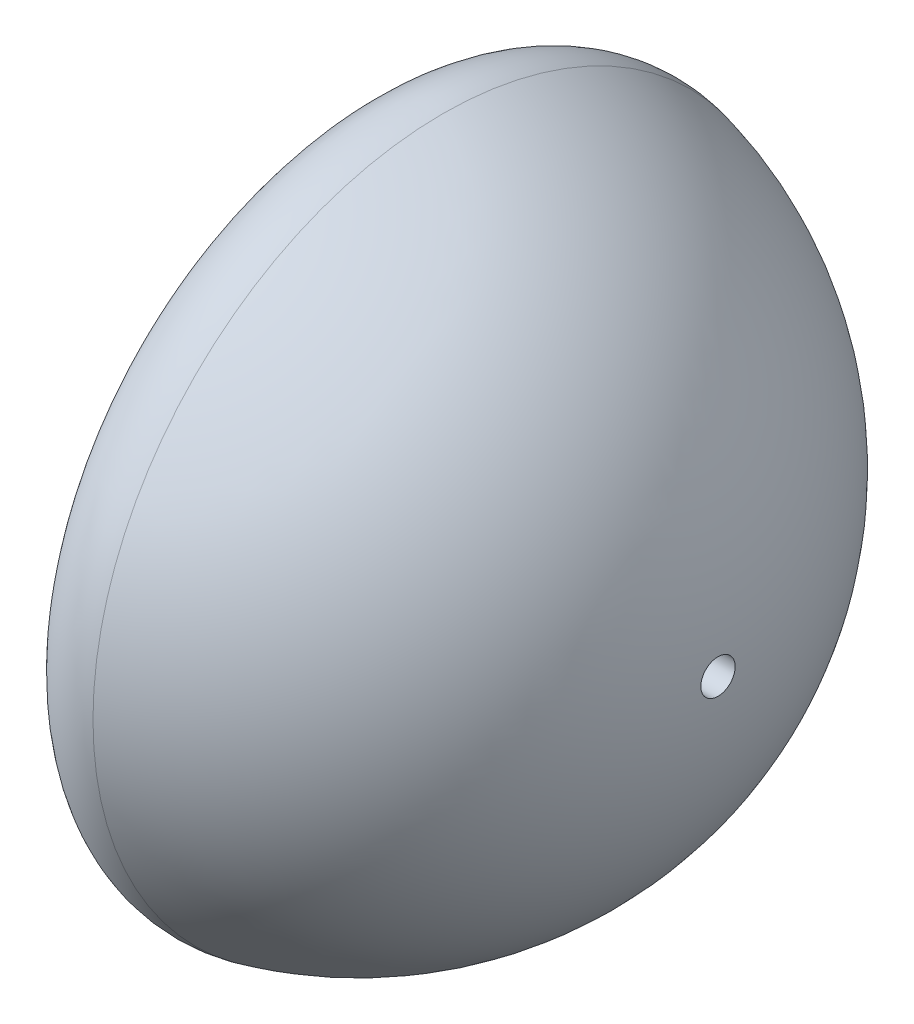
ISO-10303-21;
HEADER;
FILE_DESCRIPTION(('STEP AP214'),'2;1');
FILE_NAME('part.step','',(''),(''),'','','');
FILE_SCHEMA(('AUTOMOTIVE_DESIGN { 1 0 10303 214 1 1 1 1 }'));
ENDSEC;
DATA;
#1=APPLICATION_CONTEXT('core data for automotive mechanical design processes');
#2=APPLICATION_PROTOCOL_DEFINITION('international standard','automotive_design',2000,#1);
#3=PRODUCT_CONTEXT('',#1,'mechanical');
#4=PRODUCT('Part','Part','',(#3));
#5=PRODUCT_RELATED_PRODUCT_CATEGORY('part','',(#4));
#6=PRODUCT_DEFINITION_FORMATION('','',#4);
#7=PRODUCT_DEFINITION_CONTEXT('part definition',#1,'design');
#8=PRODUCT_DEFINITION('design','',#6,#7);
#9=PRODUCT_DEFINITION_SHAPE('','',#8);
#10=(LENGTH_UNIT() NAMED_UNIT(*) SI_UNIT(.MILLI.,.METRE.));
#11=(NAMED_UNIT(*) PLANE_ANGLE_UNIT() SI_UNIT($,.RADIAN.));
#12=(NAMED_UNIT(*) SI_UNIT($,.STERADIAN.) SOLID_ANGLE_UNIT());
#13=UNCERTAINTY_MEASURE_WITH_UNIT(LENGTH_MEASURE(1.E-05),#10,'distance_accuracy_value','');
#14=(GEOMETRIC_REPRESENTATION_CONTEXT(3) GLOBAL_UNCERTAINTY_ASSIGNED_CONTEXT((#13)) GLOBAL_UNIT_ASSIGNED_CONTEXT((#10,
#11,#12)) REPRESENTATION_CONTEXT('',''));
#15=CARTESIAN_POINT('',(0.,0.,0.));
#16=DIRECTION('',(0.,0.,1.));
#17=DIRECTION('',(1.,0.,0.));
#18=AXIS2_PLACEMENT_3D('',#15,#16,#17);
#19=CARTESIAN_POINT('',(-118.89851941294,-0.000180617697867966,0.));
#20=DIRECTION('',(1.,0.,0.));
#21=DIRECTION('',(0.,1.,0.));
#22=AXIS2_PLACEMENT_3D('',#19,#20,#21);
#23=SPHERICAL_SURFACE('',#22,52.5000661966338);
#24=CARTESIAN_POINT('',(-106.545581901332,-0.000180617697866454,0.));
#25=DIRECTION('',(-1.,0.,0.));
#26=DIRECTION('',(0.,-1.,0.));
#27=AXIS2_PLACEMENT_3D('',#24,#25,#26);
#28=CIRCLE('',#27,51.026090242985);
#29=CARTESIAN_POINT('',(-106.545581901332,51.0259096252872,0.));
#30=VERTEX_POINT('',#29);
#31=EDGE_CURVE('E40',#30,#30,#28,.F.);
#32=CARTESIAN_POINT('',(-66.4580138884564,-0.000180617697861543,0.));
#33=DIRECTION('',(1.,0.,0.));
#34=DIRECTION('',(0.,1.,0.));
#35=AXIS2_PLACEMENT_3D('',#32,#33,#34);
#36=CIRCLE('',#35,2.50006619663381);
#37=CARTESIAN_POINT('',(-66.4580138884564,2.49988557893601,0.));
#38=VERTEX_POINT('',#37);
#39=EDGE_CURVE('E44',#38,#38,#36,.T.);
#40=CARTESIAN_POINT('',(-106.545581901332,51.0259096252872,0.));
#41=CARTESIAN_POINT('',(-105.862235466137,50.8604862838573,0.));
#42=CARTESIAN_POINT('',(-105.182216561226,50.6813203845043,0.));
#43=CARTESIAN_POINT('',(-103.829921444039,50.2958271993965,0.));
#44=CARTESIAN_POINT('',(-103.157645231762,50.0894999136416,0.));
#45=CARTESIAN_POINT('',(-101.821923131907,49.650007685174,0.));
#46=CARTESIAN_POINT('',(-101.158477244329,49.4168427424614,0.));
#47=CARTESIAN_POINT('',(-99.8414858263235,48.9240539888163,0.));
#48=CARTESIAN_POINT('',(-99.1879402958957,48.6644301778839,0.));
#49=CARTESIAN_POINT('',(-97.8918045435566,48.1191420314124,0.));
#50=CARTESIAN_POINT('',(-97.2492143216454,47.8334776958734,0.));
#51=CARTESIAN_POINT('',(-95.9760262164591,47.2365697141007,0.));
#52=CARTESIAN_POINT('',(-95.3454283331841,46.925326067867,0.));
#53=CARTESIAN_POINT('',(-94.0972426452836,46.2777617352835,0.));
#54=CARTESIAN_POINT('',(-93.4796548406581,45.9414410489337,0.));
#55=CARTESIAN_POINT('',(-92.258486035752,45.2442654392567,0.));
#56=CARTESIAN_POINT('',(-91.6549050354713,44.8834105159294,0.));
#57=CARTESIAN_POINT('',(-90.4627239638938,44.1377488151916,0.));
#58=CARTESIAN_POINT('',(-89.874123892597,43.7529420377812,0.));
#59=CARTESIAN_POINT('',(-88.7128546245593,42.9599976721859,0.));
#60=CARTESIAN_POINT('',(-88.1401854278185,42.5518600840011,0.));
#61=CARTESIAN_POINT('',(-87.0117021438455,41.7129127927623,0.));
#62=CARTESIAN_POINT('',(-86.4558880566134,41.2821030897083,0.));
#63=CARTESIAN_POINT('',(-85.3620120239406,40.3985068556354,0.));
#64=CARTESIAN_POINT('',(-84.8239500785,39.9457203246166,0.));
#65=CARTESIAN_POINT('',(-83.7664467114091,39.0189011899937,0.));
#66=CARTESIAN_POINT('',(-83.2470052897589,38.5448685863895,0.));
#67=CARTESIAN_POINT('',(-82.227581300446,37.5763223511852,0.));
#68=CARTESIAN_POINT('',(-81.7275987327833,37.081808719585,0.));
#69=CARTESIAN_POINT('',(-80.7478993768614,36.0730985274483,0.));
#70=CARTESIAN_POINT('',(-80.2681825886023,35.5589019669118,0.));
#71=CARTESIAN_POINT('',(-79.329789009818,34.5116557823826,0.));
#72=CARTESIAN_POINT('',(-78.8711122192929,33.9786061583899,0.));
#73=CARTESIAN_POINT('',(-77.9755388977055,32.894514139521,0.));
#74=CARTESIAN_POINT('',(-77.5386423666431,32.3434717446448,0.));
#75=CARTESIAN_POINT('',(-76.6873346743947,31.2242835152424,0.));
#76=CARTESIAN_POINT('',(-76.2729235132085,30.6561376807161,0.));
#77=CARTESIAN_POINT('',(-75.4672553818279,29.5036595066096,0.));
#78=CARTESIAN_POINT('',(-75.0759984116335,28.9193271670293,0.));
#79=CARTESIAN_POINT('',(-74.3172701146373,27.7354190409265,0.));
#80=CARTESIAN_POINT('',(-73.9497987878354,27.1358432544039,0.));
#81=CARTESIAN_POINT('',(-73.2392348422125,25.9224158940347,0.));
#82=CARTESIAN_POINT('',(-72.8961422233914,25.3085643201881,0.));
#83=CARTESIAN_POINT('',(-72.2348894133252,24.0675760845859,0.));
#84=CARTESIAN_POINT('',(-71.91672922208,23.4404394228303,0.));
#85=CARTESIAN_POINT('',(-71.3058547482254,22.1738931517149,0.));
#86=CARTESIAN_POINT('',(-71.013140465616,21.5344835423552,0.));
#87=CARTESIAN_POINT('',(-70.453630222437,20.2444233237624,0.));
#88=CARTESIAN_POINT('',(-70.1868342618673,19.5937727145293,0.));
#89=CARTESIAN_POINT('',(-69.6795912476143,18.2822805857438,0.));
#90=CARTESIAN_POINT('',(-69.4391441939309,17.6214390661914,0.));
#91=CARTESIAN_POINT('',(-68.9849870491063,16.2906316539002,0.));
#92=CARTESIAN_POINT('',(-68.771276957965,15.6206657611614,0.));
#93=CARTESIAN_POINT('',(-68.3709386597115,14.2726908640415,0.));
#94=CARTESIAN_POINT('',(-68.1843104525992,13.5946818596604,0.));
#95=CARTESIAN_POINT('',(-67.8384370735294,12.2317149871567,0.));
#96=CARTESIAN_POINT('',(-67.6791919015719,11.546757119034,0.));
#97=CARTESIAN_POINT('',(-67.388341784323,10.1709979611615,0.));
#98=CARTESIAN_POINT('',(-67.2567368390317,9.4801966714116,0.));
#99=CARTESIAN_POINT('',(-67.021378884342,8.09386562004461,0.));
#100=CARTESIAN_POINT('',(-66.9176258749435,7.3983358584275,0.));
#101=CARTESIAN_POINT('',(-66.7381418108761,6.00367015738309,0.));
#102=CARTESIAN_POINT('',(-66.6624107562072,5.30453421795579,0.));
#103=CARTESIAN_POINT('',(-66.5390832289418,3.90378534654726,0.));
#104=CARTESIAN_POINT('',(-66.4914867563453,3.20217241456605,0.));
#105=CARTESIAN_POINT('',(-66.4580138884564,2.49988557893601,0.));
#106=B_SPLINE_CURVE_WITH_KNOTS('',3,(#40,#41,#42,#43,#44,#45,#46,#47,#48,#49,#50,#51,#52,#53,
#54,#55,#56,#57,#58,#59,#60,#61,#62,#63,#64,#65,#66,#67,#68,#69,#70,#71,#72,#73,#74,#75,#76,#77,
#78,#79,#80,#81,#82,#83,#84,#85,#86,#87,#88,#89,#90,#91,#92,#93,#94,#95,#96,#97,#98,#99,#100,
#101,#102,#103,#104,#105),.UNSPECIFIED.,.F.,.F.,(4,2,2,2,2,2,2,2,2,2,2,2,2,2,2,2,2,2,2,2,2,2,2,
2,2,2,2,2,2,2,2,2,4),(0.,2.10910944755133,4.21821889510269,6.32732834265403,8.43643779020538,
10.5455472377567,12.6546566853081,14.7637661328594,16.8728755804108,18.9819850279621,
21.0910944755134,23.2002039230648,25.3093133706161,27.4184228181675,29.5275322657188,
31.6366417132702,33.7457511608215,35.8548606083729,37.9639700559242,40.0730795034755,
42.1821889510269,44.2912983985782,46.4004078461296,48.5095172936809,50.6186267412323,
52.7277361887836,54.8368456363349,56.9459550838863,59.0550645314376,61.164173978989,
63.2732834265403,65.3823928740917,67.491502321643),.UNSPECIFIED.);
#107=EDGE_CURVE('BSEAM33',#30,#38,#106,.T.);
#108=ORIENTED_EDGE('',*,*,#31,.T.);
#109=ORIENTED_EDGE('',*,*,#39,.F.);
#110=ORIENTED_EDGE('',*,*,#107,.T.);
#111=ORIENTED_EDGE('',*,*,#107,.F.);
#112=EDGE_LOOP('',(#108,#110,#109,#111));
#113=FACE_BOUND('',#112,.T.);
#114=ADVANCED_FACE('F33',(#113),#23,.T.);
#115=CARTESIAN_POINT('',(-111.398519412942,-0.000180617697867046,0.));
#116=DIRECTION('',(1.,0.,0.));
#117=DIRECTION('',(0.,1.,0.));
#118=AXIS2_PLACEMENT_3D('',#115,#116,#117);
#119=CYLINDRICAL_SURFACE('',#118,2.50006619663381);
#120=ORIENTED_EDGE('',*,*,#39,.T.);
#121=EDGE_LOOP('',(#120));
#122=FACE_BOUND('',#121,.T.);
#123=CARTESIAN_POINT('',(-118.898519412942,-0.000180617697867965,0.));
#124=DIRECTION('',(1.,0.,0.));
#125=DIRECTION('',(0.,1.,0.));
#126=AXIS2_PLACEMENT_3D('',#123,#124,#125);
#127=CIRCLE('',#126,2.50006619663381);
#128=CARTESIAN_POINT('',(-118.898519412942,2.49988557893594,0.));
#129=VERTEX_POINT('',#128);
#130=EDGE_CURVE('E48',#129,#129,#127,.T.);
#131=ORIENTED_EDGE('',*,*,#130,.F.);
#132=EDGE_LOOP('',(#131));
#133=FACE_BOUND('',#132,.T.);
#134=ADVANCED_FACE('F56',(#122,#133),#119,.F.);
#135=CARTESIAN_POINT('',(-118.898519412942,2.49988557893594,0.));
#136=DIRECTION('',(-1.,0.,0.));
#137=DIRECTION('',(0.,-1.,0.));
#138=AXIS2_PLACEMENT_3D('',#135,#136,#137);
#139=PLANE('',#138);
#140=CARTESIAN_POINT('',(-118.898519412942,-0.000180617697867966,0.));
#141=DIRECTION('',(-1.,0.,0.));
#142=DIRECTION('',(0.,-1.,0.));
#143=AXIS2_PLACEMENT_3D('',#140,#141,#142);
#144=CIRCLE('',#143,41.3068472134864);
#145=CARTESIAN_POINT('',(-118.898519412942,-41.3070278311843,0.));
#146=VERTEX_POINT('',#145);
#147=EDGE_CURVE('E10',#146,#146,#144,.T.);
#148=ORIENTED_EDGE('',*,*,#147,.T.);
#149=EDGE_LOOP('',(#148));
#150=FACE_BOUND('',#149,.T.);
#151=ORIENTED_EDGE('',*,*,#130,.T.);
#152=EDGE_LOOP('',(#151));
#153=FACE_BOUND('',#152,.T.);
#154=ADVANCED_FACE('F54',(#150,#153),#139,.T.);
#155=CARTESIAN_POINT('',(-108.898519412943,-0.000180617697866742,0.));
#156=DIRECTION('',(-1.,0.,0.));
#157=DIRECTION('',(0.,-1.,0.));
#158=AXIS2_PLACEMENT_3D('',#155,#156,#157);
#159=TOROIDAL_SURFACE('',#158,41.3068472134864,10.);
#160=ORIENTED_EDGE('',*,*,#147,.F.);
#161=EDGE_LOOP('',(#160));
#162=FACE_BOUND('',#161,.T.);
#163=ORIENTED_EDGE('',*,*,#31,.F.);
#164=EDGE_LOOP('',(#163));
#165=FACE_BOUND('',#164,.T.);
#166=ADVANCED_FACE('F35',(#162,#165),#159,.T.);
#167=CLOSED_SHELL('',(#114,#134,#154,#166));
#168=MANIFOLD_SOLID_BREP('B2',#167);
#169=ADVANCED_BREP_SHAPE_REPRESENTATION('',(#18,#168),#14);
#170=SHAPE_DEFINITION_REPRESENTATION(#9,#169);
ENDSEC;
END-ISO-10303-21;
